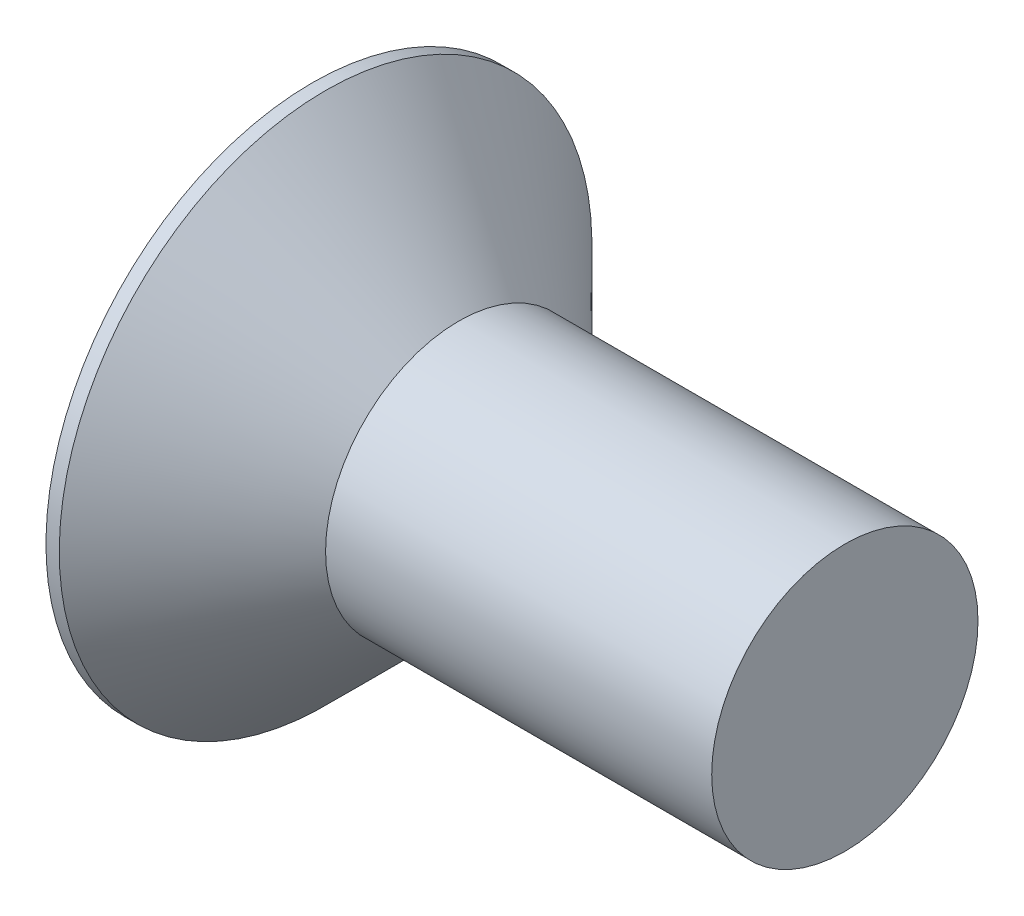
ISO-10303-21;
HEADER;
FILE_DESCRIPTION(('STEP AP214'),'2;1');
FILE_NAME('part.step','',(''),(''),'','','');
FILE_SCHEMA(('AUTOMOTIVE_DESIGN { 1 0 10303 214 1 1 1 1 }'));
ENDSEC;
DATA;
#1=APPLICATION_CONTEXT('core data for automotive mechanical design processes');
#2=APPLICATION_PROTOCOL_DEFINITION('international standard','automotive_design',2000,#1);
#3=PRODUCT_CONTEXT('',#1,'mechanical');
#4=PRODUCT('Part','Part','',(#3));
#5=PRODUCT_RELATED_PRODUCT_CATEGORY('part','',(#4));
#6=PRODUCT_DEFINITION_FORMATION('','',#4);
#7=PRODUCT_DEFINITION_CONTEXT('part definition',#1,'design');
#8=PRODUCT_DEFINITION('design','',#6,#7);
#9=PRODUCT_DEFINITION_SHAPE('','',#8);
#10=(LENGTH_UNIT() NAMED_UNIT(*) SI_UNIT(.MILLI.,.METRE.));
#11=(NAMED_UNIT(*) PLANE_ANGLE_UNIT() SI_UNIT($,.RADIAN.));
#12=(NAMED_UNIT(*) SI_UNIT($,.STERADIAN.) SOLID_ANGLE_UNIT());
#13=UNCERTAINTY_MEASURE_WITH_UNIT(LENGTH_MEASURE(1.E-05),#10,'distance_accuracy_value','');
#14=(GEOMETRIC_REPRESENTATION_CONTEXT(3) GLOBAL_UNCERTAINTY_ASSIGNED_CONTEXT((#13)) GLOBAL_UNIT_ASSIGNED_CONTEXT((#10,
#11,#12)) REPRESENTATION_CONTEXT('',''));
#15=CARTESIAN_POINT('',(0.,0.,0.));
#16=DIRECTION('',(0.,0.,1.));
#17=DIRECTION('',(1.,0.,0.));
#18=AXIS2_PLACEMENT_3D('',#15,#16,#17);
#19=CARTESIAN_POINT('',(0.,0.,0.));
#20=DIRECTION('',(-1.,0.,0.));
#21=DIRECTION('',(0.,-1.,0.));
#22=AXIS2_PLACEMENT_3D('',#19,#20,#21);
#23=PLANE('',#22);
#24=DIRECTION('',(0.,0.866025403784439,-0.5));
#25=VECTOR('',#24,1.);
#26=CARTESIAN_POINT('',(0.,0.,2.3094010767585));
#27=LINE('',#26,#25);
#28=CARTESIAN_POINT('',(0.,0.,2.3094010767585));
#29=VERTEX_POINT('',#28);
#30=CARTESIAN_POINT('',(0.,2.,1.15470053837925));
#31=VERTEX_POINT('',#30);
#32=EDGE_CURVE('E48',#29,#31,#27,.T.);
#33=ORIENTED_EDGE('',*,*,#32,.F.);
#34=DIRECTION('',(0.,0.866025403784439,0.5));
#35=VECTOR('',#34,1.);
#36=CARTESIAN_POINT('',(0.,-2.,1.15470053837925));
#37=LINE('',#36,#35);
#38=CARTESIAN_POINT('',(0.,-2.,1.15470053837925));
#39=VERTEX_POINT('',#38);
#40=EDGE_CURVE('E131',#39,#29,#37,.T.);
#41=ORIENTED_EDGE('',*,*,#40,.F.);
#42=DIRECTION('',(0.,0.,1.));
#43=VECTOR('',#42,1.);
#44=CARTESIAN_POINT('',(0.,-2.,-1.15470053837925));
#45=LINE('',#44,#43);
#46=CARTESIAN_POINT('',(0.,-2.,-1.15470053837925));
#47=VERTEX_POINT('',#46);
#48=EDGE_CURVE('E129',#47,#39,#45,.T.);
#49=ORIENTED_EDGE('',*,*,#48,.F.);
#50=DIRECTION('',(0.,-0.866025403784439,0.5));
#51=VECTOR('',#50,1.);
#52=CARTESIAN_POINT('',(0.,0.,-2.3094010767585));
#53=LINE('',#52,#51);
#54=CARTESIAN_POINT('',(0.,0.,-2.3094010767585));
#55=VERTEX_POINT('',#54);
#56=EDGE_CURVE('E96',#55,#47,#53,.T.);
#57=ORIENTED_EDGE('',*,*,#56,.F.);
#58=DIRECTION('',(0.,-0.866025403784439,-0.5));
#59=VECTOR('',#58,1.);
#60=CARTESIAN_POINT('',(0.,2.,-1.15470053837925));
#61=LINE('',#60,#59);
#62=CARTESIAN_POINT('',(0.,2.,-1.15470053837925));
#63=VERTEX_POINT('',#62);
#64=EDGE_CURVE('E125',#63,#55,#61,.T.);
#65=ORIENTED_EDGE('',*,*,#64,.F.);
#66=DIRECTION('',(0.,0.,-1.));
#67=VECTOR('',#66,1.);
#68=CARTESIAN_POINT('',(0.,2.,1.15470053837925));
#69=LINE('',#68,#67);
#70=EDGE_CURVE('E122',#31,#63,#69,.T.);
#71=ORIENTED_EDGE('',*,*,#70,.F.);
#72=EDGE_LOOP('',(#33,#41,#49,#57,#65,#71));
#73=FACE_BOUND('',#72,.T.);
#74=CARTESIAN_POINT('',(0.,0.,0.));
#75=DIRECTION('',(1.,0.,0.));
#76=DIRECTION('',(0.,1.,0.));
#77=AXIS2_PLACEMENT_3D('',#74,#75,#76);
#78=CIRCLE('',#77,5.99999999999999);
#79=CARTESIAN_POINT('',(0.,5.99999999999999,0.));
#80=VERTEX_POINT('',#79);
#81=EDGE_CURVE('E11',#80,#80,#78,.T.);
#82=ORIENTED_EDGE('',*,*,#81,.F.);
#83=EDGE_LOOP('',(#82));
#84=FACE_BOUND('',#83,.T.);
#85=ADVANCED_FACE('F34',(#73,#84),#23,.T.);
#86=CARTESIAN_POINT('',(12.,0.,0.));
#87=DIRECTION('',(1.,0.,0.));
#88=DIRECTION('',(0.,1.,0.));
#89=AXIS2_PLACEMENT_3D('',#86,#87,#88);
#90=CYLINDRICAL_SURFACE('',#89,6.);
#91=ORIENTED_EDGE('',*,*,#81,.T.);
#92=EDGE_LOOP('',(#91));
#93=FACE_BOUND('',#92,.T.);
#94=CARTESIAN_POINT('',(0.299999999999967,0.,0.));
#95=DIRECTION('',(1.,0.,0.));
#96=DIRECTION('',(0.,1.,0.));
#97=AXIS2_PLACEMENT_3D('',#94,#95,#96);
#98=CIRCLE('',#97,6.);
#99=CARTESIAN_POINT('',(0.299999999999966,6.,0.));
#100=VERTEX_POINT('',#99);
#101=EDGE_CURVE('E41',#100,#100,#98,.T.);
#102=ORIENTED_EDGE('',*,*,#101,.F.);
#103=EDGE_LOOP('',(#102));
#104=FACE_BOUND('',#103,.T.);
#105=ADVANCED_FACE('F151',(#93,#104),#90,.T.);
#106=CARTESIAN_POINT('',(3.3,0.,0.));
#107=DIRECTION('',(-1.,0.,0.));
#108=DIRECTION('',(0.,-1.,0.));
#109=AXIS2_PLACEMENT_3D('',#106,#107,#108);
#110=CONICAL_SURFACE('',#109,3.,0.785398163397443);
#111=ORIENTED_EDGE('',*,*,#101,.T.);
#112=EDGE_LOOP('',(#111));
#113=FACE_BOUND('',#112,.T.);
#114=CARTESIAN_POINT('',(3.3,0.,0.));
#115=DIRECTION('',(1.,0.,0.));
#116=DIRECTION('',(0.,1.,0.));
#117=AXIS2_PLACEMENT_3D('',#114,#115,#116);
#118=CIRCLE('',#117,3.);
#119=CARTESIAN_POINT('',(3.3,3.,0.));
#120=VERTEX_POINT('',#119);
#121=EDGE_CURVE('E143',#120,#120,#118,.T.);
#122=ORIENTED_EDGE('',*,*,#121,.F.);
#123=EDGE_LOOP('',(#122));
#124=FACE_BOUND('',#123,.T.);
#125=ADVANCED_FACE('F148',(#113,#124),#110,.T.);
#126=CARTESIAN_POINT('',(12.,0.,0.));
#127=DIRECTION('',(1.,0.,0.));
#128=DIRECTION('',(0.,1.,0.));
#129=AXIS2_PLACEMENT_3D('',#126,#127,#128);
#130=CYLINDRICAL_SURFACE('',#129,3.);
#131=ORIENTED_EDGE('',*,*,#121,.T.);
#132=EDGE_LOOP('',(#131));
#133=FACE_BOUND('',#132,.T.);
#134=CARTESIAN_POINT('',(12.,0.,0.));
#135=DIRECTION('',(1.,0.,0.));
#136=DIRECTION('',(0.,1.,0.));
#137=AXIS2_PLACEMENT_3D('',#134,#135,#136);
#138=CIRCLE('',#137,3.);
#139=CARTESIAN_POINT('',(12.,3.,0.));
#140=VERTEX_POINT('',#139);
#141=EDGE_CURVE('E135',#140,#140,#138,.T.);
#142=ORIENTED_EDGE('',*,*,#141,.F.);
#143=EDGE_LOOP('',(#142));
#144=FACE_BOUND('',#143,.T.);
#145=ADVANCED_FACE('F158',(#133,#144),#130,.T.);
#146=CARTESIAN_POINT('',(12.,3.,0.));
#147=DIRECTION('',(1.,0.,0.));
#148=DIRECTION('',(0.,1.,0.));
#149=AXIS2_PLACEMENT_3D('',#146,#147,#148);
#150=PLANE('',#149);
#151=ORIENTED_EDGE('',*,*,#141,.T.);
#152=EDGE_LOOP('',(#151));
#153=FACE_BOUND('',#152,.T.);
#154=ADVANCED_FACE('F164',(#153),#150,.T.);
#155=CARTESIAN_POINT('',(2.,0.,2.3094010767585));
#156=DIRECTION('',(0.,0.5,0.866025403784439));
#157=DIRECTION('',(0.,-0.866025403784439,0.5));
#158=AXIS2_PLACEMENT_3D('',#155,#156,#157);
#159=PLANE('',#158);
#160=ORIENTED_EDGE('',*,*,#32,.T.);
#161=DIRECTION('',(-1.,0.,0.));
#162=VECTOR('',#161,1.);
#163=CARTESIAN_POINT('',(2.,2.,1.15470053837925));
#164=LINE('',#163,#162);
#165=CARTESIAN_POINT('',(2.,2.,1.15470053837925));
#166=VERTEX_POINT('',#165);
#167=EDGE_CURVE('E78',#166,#31,#164,.T.);
#168=ORIENTED_EDGE('',*,*,#167,.F.);
#169=DIRECTION('',(0.,0.866025403784439,-0.5));
#170=VECTOR('',#169,1.);
#171=CARTESIAN_POINT('',(2.,0.,2.3094010767585));
#172=LINE('',#171,#170);
#173=CARTESIAN_POINT('',(2.,0.,2.3094010767585));
#174=VERTEX_POINT('',#173);
#175=EDGE_CURVE('E133',#174,#166,#172,.T.);
#176=ORIENTED_EDGE('',*,*,#175,.F.);
#177=DIRECTION('',(-1.,0.,0.));
#178=VECTOR('',#177,1.);
#179=CARTESIAN_POINT('',(2.,0.,2.3094010767585));
#180=LINE('',#179,#178);
#181=EDGE_CURVE('E56',#174,#29,#180,.T.);
#182=ORIENTED_EDGE('',*,*,#181,.T.);
#183=EDGE_LOOP('',(#160,#168,#176,#182));
#184=FACE_BOUND('',#183,.T.);
#185=ADVANCED_FACE('F168',(#184),#159,.F.);
#186=CARTESIAN_POINT('',(2.,-2.,1.15470053837925));
#187=DIRECTION('',(0.,-0.5,0.866025403784439));
#188=DIRECTION('',(0.,-0.866025403784439,-0.5));
#189=AXIS2_PLACEMENT_3D('',#186,#187,#188);
#190=PLANE('',#189);
#191=ORIENTED_EDGE('',*,*,#40,.T.);
#192=ORIENTED_EDGE('',*,*,#181,.F.);
#193=DIRECTION('',(0.,0.866025403784439,0.5));
#194=VECTOR('',#193,1.);
#195=CARTESIAN_POINT('',(2.,-2.,1.15470053837925));
#196=LINE('',#195,#194);
#197=CARTESIAN_POINT('',(2.,-2.,1.15470053837925));
#198=VERTEX_POINT('',#197);
#199=EDGE_CURVE('E108',#198,#174,#196,.T.);
#200=ORIENTED_EDGE('',*,*,#199,.F.);
#201=DIRECTION('',(-1.,0.,0.));
#202=VECTOR('',#201,1.);
#203=CARTESIAN_POINT('',(2.,-2.,1.15470053837925));
#204=LINE('',#203,#202);
#205=EDGE_CURVE('E100',#198,#39,#204,.T.);
#206=ORIENTED_EDGE('',*,*,#205,.T.);
#207=EDGE_LOOP('',(#191,#192,#200,#206));
#208=FACE_BOUND('',#207,.T.);
#209=ADVANCED_FACE('F172',(#208),#190,.F.);
#210=CARTESIAN_POINT('',(2.,-2.,-1.15470053837925));
#211=DIRECTION('',(0.,-1.,0.));
#212=DIRECTION('',(1.,0.,0.));
#213=AXIS2_PLACEMENT_3D('',#210,#211,#212);
#214=PLANE('',#213);
#215=ORIENTED_EDGE('',*,*,#48,.T.);
#216=ORIENTED_EDGE('',*,*,#205,.F.);
#217=DIRECTION('',(0.,0.,1.));
#218=VECTOR('',#217,1.);
#219=CARTESIAN_POINT('',(2.,-2.,-1.15470053837925));
#220=LINE('',#219,#218);
#221=CARTESIAN_POINT('',(2.,-2.,-1.15470053837925));
#222=VERTEX_POINT('',#221);
#223=EDGE_CURVE('E104',#222,#198,#220,.T.);
#224=ORIENTED_EDGE('',*,*,#223,.F.);
#225=DIRECTION('',(-1.,0.,0.));
#226=VECTOR('',#225,1.);
#227=CARTESIAN_POINT('',(2.,-2.,-1.15470053837925));
#228=LINE('',#227,#226);
#229=EDGE_CURVE('E89',#222,#47,#228,.T.);
#230=ORIENTED_EDGE('',*,*,#229,.T.);
#231=EDGE_LOOP('',(#215,#216,#224,#230));
#232=FACE_BOUND('',#231,.T.);
#233=ADVANCED_FACE('F105',(#232),#214,.F.);
#234=CARTESIAN_POINT('',(2.,0.,-2.3094010767585));
#235=DIRECTION('',(0.,-0.5,-0.866025403784439));
#236=DIRECTION('',(0.,0.866025403784439,-0.5));
#237=AXIS2_PLACEMENT_3D('',#234,#235,#236);
#238=PLANE('',#237);
#239=ORIENTED_EDGE('',*,*,#56,.T.);
#240=ORIENTED_EDGE('',*,*,#229,.F.);
#241=DIRECTION('',(0.,-0.866025403784439,0.5));
#242=VECTOR('',#241,1.);
#243=CARTESIAN_POINT('',(2.,0.,-2.3094010767585));
#244=LINE('',#243,#242);
#245=CARTESIAN_POINT('',(2.,0.,-2.3094010767585));
#246=VERTEX_POINT('',#245);
#247=EDGE_CURVE('E93',#246,#222,#244,.T.);
#248=ORIENTED_EDGE('',*,*,#247,.F.);
#249=DIRECTION('',(-1.,0.,0.));
#250=VECTOR('',#249,1.);
#251=CARTESIAN_POINT('',(2.,0.,-2.3094010767585));
#252=LINE('',#251,#250);
#253=EDGE_CURVE('E101',#246,#55,#252,.T.);
#254=ORIENTED_EDGE('',*,*,#253,.T.);
#255=EDGE_LOOP('',(#239,#240,#248,#254));
#256=FACE_BOUND('',#255,.T.);
#257=ADVANCED_FACE('F91',(#256),#238,.F.);
#258=CARTESIAN_POINT('',(2.,2.,-1.15470053837925));
#259=DIRECTION('',(0.,0.5,-0.866025403784438));
#260=DIRECTION('',(0.,0.866025403784439,0.5));
#261=AXIS2_PLACEMENT_3D('',#258,#259,#260);
#262=PLANE('',#261);
#263=ORIENTED_EDGE('',*,*,#64,.T.);
#264=ORIENTED_EDGE('',*,*,#253,.F.);
#265=DIRECTION('',(0.,-0.866025403784439,-0.5));
#266=VECTOR('',#265,1.);
#267=CARTESIAN_POINT('',(2.,2.,-1.15470053837925));
#268=LINE('',#267,#266);
#269=CARTESIAN_POINT('',(2.,2.,-1.15470053837925));
#270=VERTEX_POINT('',#269);
#271=EDGE_CURVE('E114',#270,#246,#268,.T.);
#272=ORIENTED_EDGE('',*,*,#271,.F.);
#273=DIRECTION('',(-1.,0.,0.));
#274=VECTOR('',#273,1.);
#275=CARTESIAN_POINT('',(2.,2.,-1.15470053837925));
#276=LINE('',#275,#274);
#277=EDGE_CURVE('E138',#270,#63,#276,.T.);
#278=ORIENTED_EDGE('',*,*,#277,.T.);
#279=EDGE_LOOP('',(#263,#264,#272,#278));
#280=FACE_BOUND('',#279,.T.);
#281=ADVANCED_FACE('F176',(#280),#262,.F.);
#282=CARTESIAN_POINT('',(2.,2.,1.15470053837925));
#283=DIRECTION('',(0.,1.,0.));
#284=DIRECTION('',(-1.,0.,0.));
#285=AXIS2_PLACEMENT_3D('',#282,#283,#284);
#286=PLANE('',#285);
#287=ORIENTED_EDGE('',*,*,#70,.T.);
#288=ORIENTED_EDGE('',*,*,#277,.F.);
#289=DIRECTION('',(0.,0.,-1.));
#290=VECTOR('',#289,1.);
#291=CARTESIAN_POINT('',(2.,2.,1.15470053837925));
#292=LINE('',#291,#290);
#293=EDGE_CURVE('E116',#166,#270,#292,.T.);
#294=ORIENTED_EDGE('',*,*,#293,.F.);
#295=ORIENTED_EDGE('',*,*,#167,.T.);
#296=EDGE_LOOP('',(#287,#288,#294,#295));
#297=FACE_BOUND('',#296,.T.);
#298=ADVANCED_FACE('F173',(#297),#286,.F.);
#299=CARTESIAN_POINT('',(2.,0.,0.));
#300=DIRECTION('',(-1.,0.,0.));
#301=DIRECTION('',(0.,-1.,0.));
#302=AXIS2_PLACEMENT_3D('',#299,#300,#301);
#303=PLANE('',#302);
#304=ORIENTED_EDGE('',*,*,#175,.T.);
#305=ORIENTED_EDGE('',*,*,#293,.T.);
#306=ORIENTED_EDGE('',*,*,#271,.T.);
#307=ORIENTED_EDGE('',*,*,#247,.T.);
#308=ORIENTED_EDGE('',*,*,#223,.T.);
#309=ORIENTED_EDGE('',*,*,#199,.T.);
#310=EDGE_LOOP('',(#304,#305,#306,#307,#308,#309));
#311=FACE_BOUND('',#310,.T.);
#312=ADVANCED_FACE('F111',(#311),#303,.T.);
#313=CLOSED_SHELL('',(#85,#105,#125,#145,#154,#185,#209,#233,#257,#281,#298,#312));
#314=MANIFOLD_SOLID_BREP('B2',#313);
#315=ADVANCED_BREP_SHAPE_REPRESENTATION('',(#18,#314),#14);
#316=SHAPE_DEFINITION_REPRESENTATION(#9,#315);
ENDSEC;
END-ISO-10303-21;
